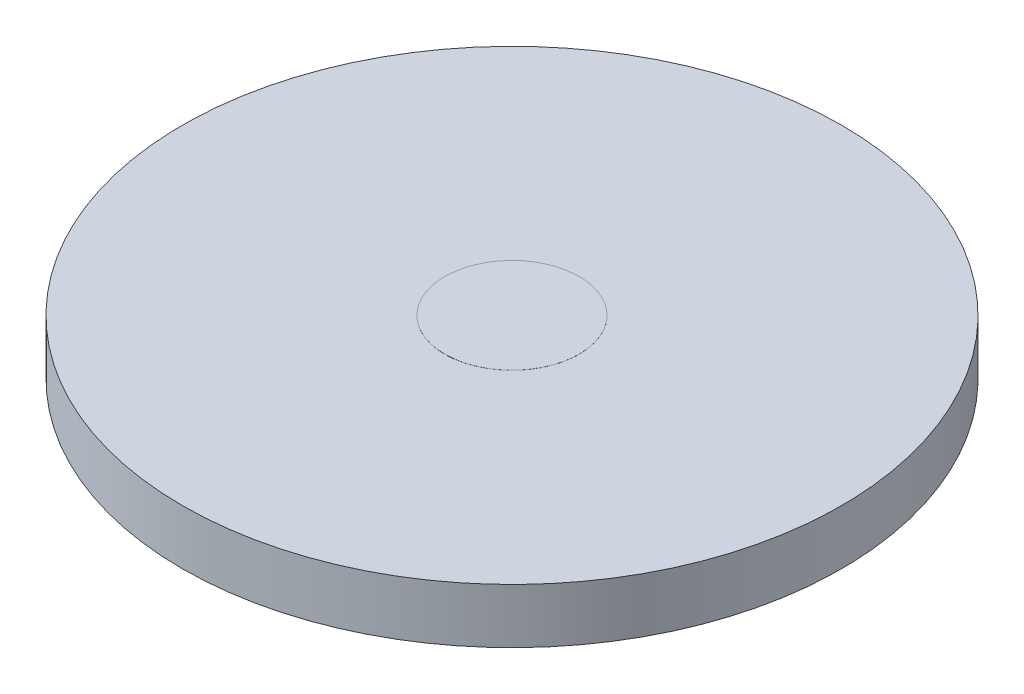
ISO-10303-21;
HEADER;
FILE_DESCRIPTION(('STEP AP214'),'2;1');
FILE_NAME('part.step','',(''),(''),'','','');
FILE_SCHEMA(('AUTOMOTIVE_DESIGN { 1 0 10303 214 1 1 1 1 }'));
ENDSEC;
DATA;
#1=APPLICATION_CONTEXT('core data for automotive mechanical design processes');
#2=APPLICATION_PROTOCOL_DEFINITION('international standard','automotive_design',2000,#1);
#3=PRODUCT_CONTEXT('',#1,'mechanical');
#4=PRODUCT('Part','Part','',(#3));
#5=PRODUCT_RELATED_PRODUCT_CATEGORY('part','',(#4));
#6=PRODUCT_DEFINITION_FORMATION('','',#4);
#7=PRODUCT_DEFINITION_CONTEXT('part definition',#1,'design');
#8=PRODUCT_DEFINITION('design','',#6,#7);
#9=PRODUCT_DEFINITION_SHAPE('','',#8);
#10=(LENGTH_UNIT() NAMED_UNIT(*) SI_UNIT(.MILLI.,.METRE.));
#11=(NAMED_UNIT(*) PLANE_ANGLE_UNIT() SI_UNIT($,.RADIAN.));
#12=(NAMED_UNIT(*) SI_UNIT($,.STERADIAN.) SOLID_ANGLE_UNIT());
#13=UNCERTAINTY_MEASURE_WITH_UNIT(LENGTH_MEASURE(1.E-05),#10,'distance_accuracy_value','');
#14=(GEOMETRIC_REPRESENTATION_CONTEXT(3) GLOBAL_UNCERTAINTY_ASSIGNED_CONTEXT((#13)) GLOBAL_UNIT_ASSIGNED_CONTEXT((#10,
#11,#12)) REPRESENTATION_CONTEXT('',''));
#15=CARTESIAN_POINT('',(0.,0.,0.));
#16=DIRECTION('',(0.,0.,1.));
#17=DIRECTION('',(1.,0.,0.));
#18=AXIS2_PLACEMENT_3D('',#15,#16,#17);
#19=CARTESIAN_POINT('',(0.,10.09,0.));
#20=DIRECTION('',(0.,-1.,0.));
#21=DIRECTION('',(0.,0.,-1.));
#22=AXIS2_PLACEMENT_3D('',#19,#20,#21);
#23=CYLINDRICAL_SURFACE('',#22,121.5);
#24=CARTESIAN_POINT('',(0.,10.09,0.));
#25=DIRECTION('',(0.,1.,0.));
#26=DIRECTION('',(0.,0.,1.));
#27=AXIS2_PLACEMENT_3D('',#24,#25,#26);
#28=CIRCLE('',#27,121.5);
#29=CARTESIAN_POINT('',(0.,10.09,121.5));
#30=VERTEX_POINT('',#29);
#31=EDGE_CURVE('E40',#30,#30,#28,.T.);
#32=ORIENTED_EDGE('',*,*,#31,.F.);
#33=EDGE_LOOP('',(#32));
#34=FACE_BOUND('',#33,.T.);
#35=CARTESIAN_POINT('',(0.,-10.09,0.));
#36=DIRECTION('',(0.,1.,0.));
#37=DIRECTION('',(0.,0.,1.));
#38=AXIS2_PLACEMENT_3D('',#35,#36,#37);
#39=CIRCLE('',#38,121.5);
#40=CARTESIAN_POINT('',(0.,-10.09,121.5));
#41=VERTEX_POINT('',#40);
#42=EDGE_CURVE('E44',#41,#41,#39,.T.);
#43=ORIENTED_EDGE('',*,*,#42,.T.);
#44=EDGE_LOOP('',(#43));
#45=FACE_BOUND('',#44,.T.);
#46=ADVANCED_FACE('F34',(#34,#45),#23,.T.);
#47=CARTESIAN_POINT('',(0.,10.09,0.));
#48=DIRECTION('',(0.,1.,0.));
#49=DIRECTION('',(0.,0.,1.));
#50=AXIS2_PLACEMENT_3D('',#47,#48,#49);
#51=PLANE('',#50);
#52=CARTESIAN_POINT('',(0.,10.09,0.));
#53=DIRECTION('',(0.,1.,0.));
#54=DIRECTION('',(0.,0.,1.));
#55=AXIS2_PLACEMENT_3D('',#52,#53,#54);
#56=CIRCLE('',#55,24.795);
#57=CARTESIAN_POINT('',(0.,10.09,24.795));
#58=VERTEX_POINT('',#57);
#59=EDGE_CURVE('E49',#58,#58,#56,.F.);
#60=ORIENTED_EDGE('',*,*,#59,.T.);
#61=EDGE_LOOP('',(#60));
#62=FACE_BOUND('',#61,.T.);
#63=ORIENTED_EDGE('',*,*,#31,.T.);
#64=EDGE_LOOP('',(#63));
#65=FACE_BOUND('',#64,.T.);
#66=ADVANCED_FACE('F76',(#62,#65),#51,.T.);
#67=CARTESIAN_POINT('',(0.,-10.09,0.));
#68=DIRECTION('',(0.,1.,0.));
#69=DIRECTION('',(0.,0.,1.));
#70=AXIS2_PLACEMENT_3D('',#67,#68,#69);
#71=PLANE('',#70);
#72=CARTESIAN_POINT('',(0.,-10.09,0.));
#73=DIRECTION('',(0.,1.,0.));
#74=DIRECTION('',(0.,0.,1.));
#75=AXIS2_PLACEMENT_3D('',#72,#73,#74);
#76=CIRCLE('',#75,24.795);
#77=CARTESIAN_POINT('',(0.,-10.09,24.795));
#78=VERTEX_POINT('',#77);
#79=EDGE_CURVE('E11',#78,#78,#76,.F.);
#80=ORIENTED_EDGE('',*,*,#79,.F.);
#81=EDGE_LOOP('',(#80));
#82=FACE_BOUND('',#81,.T.);
#83=ORIENTED_EDGE('',*,*,#42,.F.);
#84=EDGE_LOOP('',(#83));
#85=FACE_BOUND('',#84,.T.);
#86=ADVANCED_FACE('F72',(#82,#85),#71,.F.);
#87=CARTESIAN_POINT('',(0.,-10.39,0.));
#88=DIRECTION('',(0.,1.,0.));
#89=DIRECTION('',(0.,0.,1.));
#90=AXIS2_PLACEMENT_3D('',#87,#88,#89);
#91=PLANE('',#90);
#92=CARTESIAN_POINT('',(0.,-10.39,0.));
#93=DIRECTION('',(0.,1.,0.));
#94=DIRECTION('',(0.,0.,1.));
#95=AXIS2_PLACEMENT_3D('',#92,#93,#94);
#96=CIRCLE('',#95,24.795);
#97=CARTESIAN_POINT('',(0.,-10.39,24.795));
#98=VERTEX_POINT('',#97);
#99=EDGE_CURVE('E56',#98,#98,#96,.F.);
#100=ORIENTED_EDGE('',*,*,#99,.T.);
#101=EDGE_LOOP('',(#100));
#102=FACE_BOUND('',#101,.T.);
#103=ADVANCED_FACE('F60',(#102),#91,.F.);
#104=CARTESIAN_POINT('',(0.,80.2608505580818,0.));
#105=DIRECTION('',(0.,-1.,0.));
#106=DIRECTION('',(0.,0.,-1.));
#107=AXIS2_PLACEMENT_3D('',#104,#105,#106);
#108=CYLINDRICAL_SURFACE('',#107,24.795);
#109=ORIENTED_EDGE('',*,*,#99,.F.);
#110=EDGE_LOOP('',(#109));
#111=FACE_BOUND('',#110,.T.);
#112=ORIENTED_EDGE('',*,*,#79,.T.);
#113=EDGE_LOOP('',(#112));
#114=FACE_BOUND('',#113,.T.);
#115=ADVANCED_FACE('F62',(#111,#114),#108,.T.);
#116=ORIENTED_EDGE('',*,*,#59,.F.);
#117=EDGE_LOOP('',(#116));
#118=FACE_BOUND('',#117,.T.);
#119=CARTESIAN_POINT('',(0.,10.11,0.));
#120=DIRECTION('',(0.,1.,0.));
#121=DIRECTION('',(0.,0.,1.));
#122=AXIS2_PLACEMENT_3D('',#119,#120,#121);
#123=CIRCLE('',#122,24.795);
#124=CARTESIAN_POINT('',(0.,10.11,24.795));
#125=VERTEX_POINT('',#124);
#126=EDGE_CURVE('E53',#125,#125,#123,.T.);
#127=ORIENTED_EDGE('',*,*,#126,.F.);
#128=EDGE_LOOP('',(#127));
#129=FACE_BOUND('',#128,.T.);
#130=ADVANCED_FACE('F64',(#118,#129),#108,.T.);
#131=CARTESIAN_POINT('',(0.,10.11,0.));
#132=DIRECTION('',(0.,1.,0.));
#133=DIRECTION('',(0.,0.,1.));
#134=AXIS2_PLACEMENT_3D('',#131,#132,#133);
#135=PLANE('',#134);
#136=ORIENTED_EDGE('',*,*,#126,.T.);
#137=EDGE_LOOP('',(#136));
#138=FACE_BOUND('',#137,.T.);
#139=ADVANCED_FACE('F70',(#138),#135,.T.);
#140=CLOSED_SHELL('',(#46,#66,#86,#103,#115,#130,#139));
#141=MANIFOLD_SOLID_BREP('B2',#140);
#142=ADVANCED_BREP_SHAPE_REPRESENTATION('',(#18,#141),#14);
#143=SHAPE_DEFINITION_REPRESENTATION(#9,#142);
ENDSEC;
END-ISO-10303-21;
